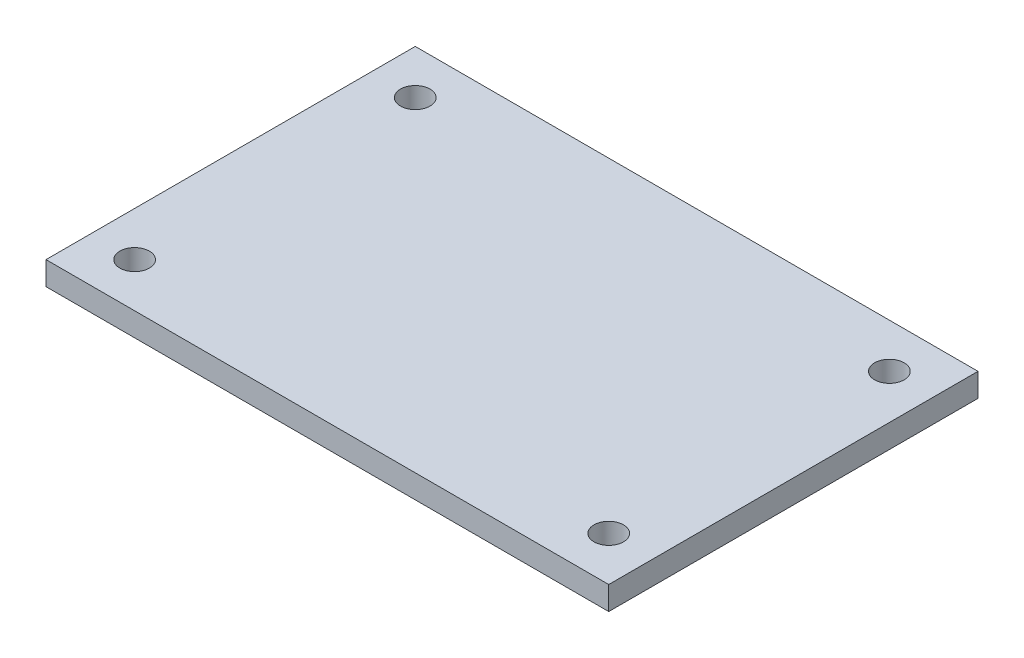
ISO-10303-21;
HEADER;
FILE_DESCRIPTION(('STEP AP214'),'2;1');
FILE_NAME('part.step','',(''),(''),'','','');
FILE_SCHEMA(('AUTOMOTIVE_DESIGN { 1 0 10303 214 1 1 1 1 }'));
ENDSEC;
DATA;
#1=APPLICATION_CONTEXT('core data for automotive mechanical design processes');
#2=APPLICATION_PROTOCOL_DEFINITION('international standard','automotive_design',2000,#1);
#3=PRODUCT_CONTEXT('',#1,'mechanical');
#4=PRODUCT('Part','Part','',(#3));
#5=PRODUCT_RELATED_PRODUCT_CATEGORY('part','',(#4));
#6=PRODUCT_DEFINITION_FORMATION('','',#4);
#7=PRODUCT_DEFINITION_CONTEXT('part definition',#1,'design');
#8=PRODUCT_DEFINITION('design','',#6,#7);
#9=PRODUCT_DEFINITION_SHAPE('','',#8);
#10=(LENGTH_UNIT() NAMED_UNIT(*) SI_UNIT(.MILLI.,.METRE.));
#11=(NAMED_UNIT(*) PLANE_ANGLE_UNIT() SI_UNIT($,.RADIAN.));
#12=(NAMED_UNIT(*) SI_UNIT($,.STERADIAN.) SOLID_ANGLE_UNIT());
#13=UNCERTAINTY_MEASURE_WITH_UNIT(LENGTH_MEASURE(1.E-05),#10,'distance_accuracy_value','');
#14=(GEOMETRIC_REPRESENTATION_CONTEXT(3) GLOBAL_UNCERTAINTY_ASSIGNED_CONTEXT((#13)) GLOBAL_UNIT_ASSIGNED_CONTEXT((#10,
#11,#12)) REPRESENTATION_CONTEXT('',''));
#15=CARTESIAN_POINT('',(0.,0.,0.));
#16=DIRECTION('',(0.,0.,1.));
#17=DIRECTION('',(1.,0.,0.));
#18=AXIS2_PLACEMENT_3D('',#15,#16,#17);
#19=CARTESIAN_POINT('',(0.,125.918154424768,0.));
#20=DIRECTION('',(0.,-1.,0.));
#21=DIRECTION('',(0.,0.,-1.));
#22=AXIS2_PLACEMENT_3D('',#19,#20,#21);
#23=PLANE('',#22);
#24=CARTESIAN_POINT('',(-15.2943128246472,125.918154424768,32.8895949971044));
#25=DIRECTION('',(0.,-1.,0.));
#26=DIRECTION('',(0.,0.,1.));
#27=AXIS2_PLACEMENT_3D('',#24,#25,#26);
#28=CIRCLE('',#27,2.);
#29=CARTESIAN_POINT('',(-15.2943128246472,125.918154424768,34.8895949971044));
#30=VERTEX_POINT('',#29);
#31=EDGE_CURVE('E121',#30,#30,#28,.T.);
#32=ORIENTED_EDGE('',*,*,#31,.F.);
#33=EDGE_LOOP('',(#32));
#34=FACE_BOUND('',#33,.T.);
#35=CARTESIAN_POINT('',(48.9056871753528,125.918154424768,32.8895949971044));
#36=DIRECTION('',(0.,-1.,0.));
#37=DIRECTION('',(0.,0.,-1.));
#38=AXIS2_PLACEMENT_3D('',#35,#36,#37);
#39=CIRCLE('',#38,2.);
#40=CARTESIAN_POINT('',(48.9056871753528,125.918154424768,30.8895949971044));
#41=VERTEX_POINT('',#40);
#42=EDGE_CURVE('E100',#41,#41,#39,.T.);
#43=ORIENTED_EDGE('',*,*,#42,.F.);
#44=EDGE_LOOP('',(#43));
#45=FACE_BOUND('',#44,.T.);
#46=DIRECTION('',(0.,0.,1.));
#47=VECTOR('',#46,1.);
#48=CARTESIAN_POINT('',(54.9056871753528,125.918154424768,-11.1104050028956));
#49=LINE('',#48,#47);
#50=CARTESIAN_POINT('',(54.9056871753528,125.918154424768,-11.1104050028956));
#51=VERTEX_POINT('',#50);
#52=CARTESIAN_POINT('',(54.9056871753528,125.918154424768,38.8895949971044));
#53=VERTEX_POINT('',#52);
#54=EDGE_CURVE('E85',#51,#53,#49,.T.);
#55=ORIENTED_EDGE('',*,*,#54,.T.);
#56=DIRECTION('',(-1.,0.,0.));
#57=VECTOR('',#56,1.);
#58=CARTESIAN_POINT('',(54.9056871753528,125.918154424768,38.8895949971044));
#59=LINE('',#58,#57);
#60=CARTESIAN_POINT('',(-21.2943128246472,125.918154424768,38.8895949971044));
#61=VERTEX_POINT('',#60);
#62=EDGE_CURVE('E80',#53,#61,#59,.T.);
#63=ORIENTED_EDGE('',*,*,#62,.T.);
#64=DIRECTION('',(0.,0.,-1.));
#65=VECTOR('',#64,1.);
#66=CARTESIAN_POINT('',(-21.2943128246472,125.918154424768,-11.1104050028956));
#67=LINE('',#66,#65);
#68=CARTESIAN_POINT('',(-21.2943128246472,125.918154424768,-11.1104050028956));
#69=VERTEX_POINT('',#68);
#70=EDGE_CURVE('E83',#61,#69,#67,.T.);
#71=ORIENTED_EDGE('',*,*,#70,.T.);
#72=DIRECTION('',(1.,0.,0.));
#73=VECTOR('',#72,1.);
#74=CARTESIAN_POINT('',(54.9056871753528,125.918154424768,-11.1104050028956));
#75=LINE('',#74,#73);
#76=EDGE_CURVE('E50',#69,#51,#75,.T.);
#77=ORIENTED_EDGE('',*,*,#76,.T.);
#78=EDGE_LOOP('',(#55,#63,#71,#77));
#79=FACE_BOUND('',#78,.T.);
#80=CARTESIAN_POINT('',(48.9056871753528,125.918154424768,-5.11040500289555));
#81=DIRECTION('',(0.,-1.,0.));
#82=DIRECTION('',(0.,0.,-1.));
#83=AXIS2_PLACEMENT_3D('',#80,#81,#82);
#84=CIRCLE('',#83,2.);
#85=CARTESIAN_POINT('',(48.9056871753528,125.918154424768,-7.11040500289556));
#86=VERTEX_POINT('',#85);
#87=EDGE_CURVE('E115',#86,#86,#84,.T.);
#88=ORIENTED_EDGE('',*,*,#87,.F.);
#89=EDGE_LOOP('',(#88));
#90=FACE_BOUND('',#89,.T.);
#91=CARTESIAN_POINT('',(-15.2943128246472,125.918154424768,-5.11040500289556));
#92=DIRECTION('',(0.,-1.,0.));
#93=DIRECTION('',(0.,0.,1.));
#94=AXIS2_PLACEMENT_3D('',#91,#92,#93);
#95=CIRCLE('',#94,2.);
#96=CARTESIAN_POINT('',(-15.2943128246472,125.918154424768,-3.11040500289556));
#97=VERTEX_POINT('',#96);
#98=EDGE_CURVE('E127',#97,#97,#95,.T.);
#99=ORIENTED_EDGE('',*,*,#98,.F.);
#100=EDGE_LOOP('',(#99));
#101=FACE_BOUND('',#100,.T.);
#102=ADVANCED_FACE('F33',(#34,#45,#79,#90,#101),#23,.T.);
#103=CARTESIAN_POINT('',(0.,129.093154424768,0.));
#104=DIRECTION('',(0.,-1.,0.));
#105=DIRECTION('',(0.,0.,-1.));
#106=AXIS2_PLACEMENT_3D('',#103,#104,#105);
#107=PLANE('',#106);
#108=CARTESIAN_POINT('',(-15.2943128246472,129.093154424768,32.8895949971044));
#109=DIRECTION('',(0.,-1.,0.));
#110=DIRECTION('',(0.,0.,1.));
#111=AXIS2_PLACEMENT_3D('',#108,#109,#110);
#112=CIRCLE('',#111,2.);
#113=CARTESIAN_POINT('',(-15.2943128246472,129.093154424768,34.8895949971044));
#114=VERTEX_POINT('',#113);
#115=EDGE_CURVE('E124',#114,#114,#112,.T.);
#116=ORIENTED_EDGE('',*,*,#115,.T.);
#117=EDGE_LOOP('',(#116));
#118=FACE_BOUND('',#117,.T.);
#119=CARTESIAN_POINT('',(48.9056871753528,129.093154424768,32.8895949971044));
#120=DIRECTION('',(0.,-1.,0.));
#121=DIRECTION('',(0.,0.,-1.));
#122=AXIS2_PLACEMENT_3D('',#119,#120,#121);
#123=CIRCLE('',#122,2.);
#124=CARTESIAN_POINT('',(48.9056871753528,129.093154424768,30.8895949971044));
#125=VERTEX_POINT('',#124);
#126=EDGE_CURVE('E112',#125,#125,#123,.T.);
#127=ORIENTED_EDGE('',*,*,#126,.T.);
#128=EDGE_LOOP('',(#127));
#129=FACE_BOUND('',#128,.T.);
#130=DIRECTION('',(0.,0.,1.));
#131=VECTOR('',#130,1.);
#132=CARTESIAN_POINT('',(54.9056871753528,129.093154424768,-11.1104050028956));
#133=LINE('',#132,#131);
#134=CARTESIAN_POINT('',(54.9056871753528,129.093154424768,-11.1104050028956));
#135=VERTEX_POINT('',#134);
#136=CARTESIAN_POINT('',(54.9056871753528,129.093154424768,38.8895949971044));
#137=VERTEX_POINT('',#136);
#138=EDGE_CURVE('E97',#135,#137,#133,.T.);
#139=ORIENTED_EDGE('',*,*,#138,.F.);
#140=DIRECTION('',(1.,0.,0.));
#141=VECTOR('',#140,1.);
#142=CARTESIAN_POINT('',(54.9056871753528,129.093154424768,-11.1104050028956));
#143=LINE('',#142,#141);
#144=CARTESIAN_POINT('',(-21.2943128246472,129.093154424768,-11.1104050028956));
#145=VERTEX_POINT('',#144);
#146=EDGE_CURVE('E73',#145,#135,#143,.T.);
#147=ORIENTED_EDGE('',*,*,#146,.F.);
#148=DIRECTION('',(0.,0.,-1.));
#149=VECTOR('',#148,1.);
#150=CARTESIAN_POINT('',(-21.2943128246472,129.093154424768,-11.1104050028956));
#151=LINE('',#150,#149);
#152=CARTESIAN_POINT('',(-21.2943128246472,129.093154424768,38.8895949971044));
#153=VERTEX_POINT('',#152);
#154=EDGE_CURVE('E67',#153,#145,#151,.T.);
#155=ORIENTED_EDGE('',*,*,#154,.F.);
#156=DIRECTION('',(-1.,0.,0.));
#157=VECTOR('',#156,1.);
#158=CARTESIAN_POINT('',(54.9056871753528,129.093154424768,38.8895949971044));
#159=LINE('',#158,#157);
#160=EDGE_CURVE('E89',#137,#153,#159,.T.);
#161=ORIENTED_EDGE('',*,*,#160,.F.);
#162=EDGE_LOOP('',(#139,#147,#155,#161));
#163=FACE_BOUND('',#162,.T.);
#164=CARTESIAN_POINT('',(48.9056871753528,129.093154424768,-5.11040500289555));
#165=DIRECTION('',(0.,-1.,0.));
#166=DIRECTION('',(0.,0.,-1.));
#167=AXIS2_PLACEMENT_3D('',#164,#165,#166);
#168=CIRCLE('',#167,2.);
#169=CARTESIAN_POINT('',(48.9056871753528,129.093154424768,-7.11040500289556));
#170=VERTEX_POINT('',#169);
#171=EDGE_CURVE('E118',#170,#170,#168,.T.);
#172=ORIENTED_EDGE('',*,*,#171,.T.);
#173=EDGE_LOOP('',(#172));
#174=FACE_BOUND('',#173,.T.);
#175=CARTESIAN_POINT('',(-15.2943128246472,129.093154424768,-5.11040500289556));
#176=DIRECTION('',(0.,-1.,0.));
#177=DIRECTION('',(0.,0.,1.));
#178=AXIS2_PLACEMENT_3D('',#175,#176,#177);
#179=CIRCLE('',#178,2.);
#180=CARTESIAN_POINT('',(-15.2943128246472,129.093154424768,-3.11040500289556));
#181=VERTEX_POINT('',#180);
#182=EDGE_CURVE('E130',#181,#181,#179,.T.);
#183=ORIENTED_EDGE('',*,*,#182,.T.);
#184=EDGE_LOOP('',(#183));
#185=FACE_BOUND('',#184,.T.);
#186=ADVANCED_FACE('F108',(#118,#129,#163,#174,#185),#107,.F.);
#187=CARTESIAN_POINT('',(54.9056871753528,125.918154424768,-11.1104050028956));
#188=DIRECTION('',(-1.,0.,0.));
#189=DIRECTION('',(0.,0.,1.));
#190=AXIS2_PLACEMENT_3D('',#187,#188,#189);
#191=PLANE('',#190);
#192=ORIENTED_EDGE('',*,*,#138,.T.);
#193=DIRECTION('',(0.,1.,0.));
#194=VECTOR('',#193,1.);
#195=CARTESIAN_POINT('',(54.9056871753528,125.918154424768,38.8895949971044));
#196=LINE('',#195,#194);
#197=EDGE_CURVE('E11',#53,#137,#196,.T.);
#198=ORIENTED_EDGE('',*,*,#197,.F.);
#199=ORIENTED_EDGE('',*,*,#54,.F.);
#200=DIRECTION('',(0.,1.,0.));
#201=VECTOR('',#200,1.);
#202=CARTESIAN_POINT('',(54.9056871753528,125.918154424768,-11.1104050028956));
#203=LINE('',#202,#201);
#204=EDGE_CURVE('E93',#51,#135,#203,.T.);
#205=ORIENTED_EDGE('',*,*,#204,.T.);
#206=EDGE_LOOP('',(#192,#198,#199,#205));
#207=FACE_BOUND('',#206,.T.);
#208=ADVANCED_FACE('F35',(#207),#191,.F.);
#209=CARTESIAN_POINT('',(54.9056871753528,125.918154424768,38.8895949971044));
#210=DIRECTION('',(0.,0.,-1.));
#211=DIRECTION('',(-1.,0.,0.));
#212=AXIS2_PLACEMENT_3D('',#209,#210,#211);
#213=PLANE('',#212);
#214=ORIENTED_EDGE('',*,*,#160,.T.);
#215=DIRECTION('',(0.,1.,0.));
#216=VECTOR('',#215,1.);
#217=CARTESIAN_POINT('',(-21.2943128246472,125.918154424768,38.8895949971044));
#218=LINE('',#217,#216);
#219=EDGE_CURVE('E42',#61,#153,#218,.T.);
#220=ORIENTED_EDGE('',*,*,#219,.F.);
#221=ORIENTED_EDGE('',*,*,#62,.F.);
#222=ORIENTED_EDGE('',*,*,#197,.T.);
#223=EDGE_LOOP('',(#214,#220,#221,#222));
#224=FACE_BOUND('',#223,.T.);
#225=ADVANCED_FACE('F88',(#224),#213,.F.);
#226=CARTESIAN_POINT('',(-21.2943128246472,125.918154424768,-11.1104050028956));
#227=DIRECTION('',(1.,0.,0.));
#228=DIRECTION('',(0.,0.,-1.));
#229=AXIS2_PLACEMENT_3D('',#226,#227,#228);
#230=PLANE('',#229);
#231=ORIENTED_EDGE('',*,*,#154,.T.);
#232=DIRECTION('',(0.,1.,0.));
#233=VECTOR('',#232,1.);
#234=CARTESIAN_POINT('',(-21.2943128246472,125.918154424768,-11.1104050028956));
#235=LINE('',#234,#233);
#236=EDGE_CURVE('E90',#69,#145,#235,.T.);
#237=ORIENTED_EDGE('',*,*,#236,.F.);
#238=ORIENTED_EDGE('',*,*,#70,.F.);
#239=ORIENTED_EDGE('',*,*,#219,.T.);
#240=EDGE_LOOP('',(#231,#237,#238,#239));
#241=FACE_BOUND('',#240,.T.);
#242=ADVANCED_FACE('F91',(#241),#230,.F.);
#243=CARTESIAN_POINT('',(54.9056871753528,125.918154424768,-11.1104050028956));
#244=DIRECTION('',(0.,0.,1.));
#245=DIRECTION('',(1.,0.,0.));
#246=AXIS2_PLACEMENT_3D('',#243,#244,#245);
#247=PLANE('',#246);
#248=ORIENTED_EDGE('',*,*,#146,.T.);
#249=ORIENTED_EDGE('',*,*,#204,.F.);
#250=ORIENTED_EDGE('',*,*,#76,.F.);
#251=ORIENTED_EDGE('',*,*,#236,.T.);
#252=EDGE_LOOP('',(#248,#249,#250,#251));
#253=FACE_BOUND('',#252,.T.);
#254=ADVANCED_FACE('F105',(#253),#247,.F.);
#255=CARTESIAN_POINT('',(48.9056871753528,125.918154424768,32.8895949971044));
#256=DIRECTION('',(0.,1.,0.));
#257=DIRECTION('',(0.,0.,1.));
#258=AXIS2_PLACEMENT_3D('',#255,#256,#257);
#259=CYLINDRICAL_SURFACE('',#258,2.);
#260=ORIENTED_EDGE('',*,*,#42,.T.);
#261=EDGE_LOOP('',(#260));
#262=FACE_BOUND('',#261,.T.);
#263=ORIENTED_EDGE('',*,*,#126,.F.);
#264=EDGE_LOOP('',(#263));
#265=FACE_BOUND('',#264,.T.);
#266=ADVANCED_FACE('F150',(#262,#265),#259,.F.);
#267=CARTESIAN_POINT('',(48.9056871753528,125.918154424768,-5.11040500289555));
#268=DIRECTION('',(0.,1.,0.));
#269=DIRECTION('',(0.,0.,1.));
#270=AXIS2_PLACEMENT_3D('',#267,#268,#269);
#271=CYLINDRICAL_SURFACE('',#270,2.);
#272=ORIENTED_EDGE('',*,*,#87,.T.);
#273=EDGE_LOOP('',(#272));
#274=FACE_BOUND('',#273,.T.);
#275=ORIENTED_EDGE('',*,*,#171,.F.);
#276=EDGE_LOOP('',(#275));
#277=FACE_BOUND('',#276,.T.);
#278=ADVANCED_FACE('F195',(#274,#277),#271,.F.);
#279=CARTESIAN_POINT('',(-15.2943128246472,125.918154424768,32.8895949971044));
#280=DIRECTION('',(0.,1.,0.));
#281=DIRECTION('',(0.,0.,1.));
#282=AXIS2_PLACEMENT_3D('',#279,#280,#281);
#283=CYLINDRICAL_SURFACE('',#282,2.);
#284=ORIENTED_EDGE('',*,*,#31,.T.);
#285=EDGE_LOOP('',(#284));
#286=FACE_BOUND('',#285,.T.);
#287=ORIENTED_EDGE('',*,*,#115,.F.);
#288=EDGE_LOOP('',(#287));
#289=FACE_BOUND('',#288,.T.);
#290=ADVANCED_FACE('F203',(#286,#289),#283,.F.);
#291=CARTESIAN_POINT('',(-15.2943128246472,125.918154424768,-5.11040500289556));
#292=DIRECTION('',(0.,1.,0.));
#293=DIRECTION('',(0.,0.,1.));
#294=AXIS2_PLACEMENT_3D('',#291,#292,#293);
#295=CYLINDRICAL_SURFACE('',#294,2.);
#296=ORIENTED_EDGE('',*,*,#98,.T.);
#297=EDGE_LOOP('',(#296));
#298=FACE_BOUND('',#297,.T.);
#299=ORIENTED_EDGE('',*,*,#182,.F.);
#300=EDGE_LOOP('',(#299));
#301=FACE_BOUND('',#300,.T.);
#302=ADVANCED_FACE('F136',(#298,#301),#295,.F.);
#303=CLOSED_SHELL('',(#102,#186,#208,#225,#242,#254,#266,#278,#290,#302));
#304=MANIFOLD_SOLID_BREP('B2',#303);
#305=ADVANCED_BREP_SHAPE_REPRESENTATION('',(#18,#304),#14);
#306=SHAPE_DEFINITION_REPRESENTATION(#9,#305);
ENDSEC;
END-ISO-10303-21;
